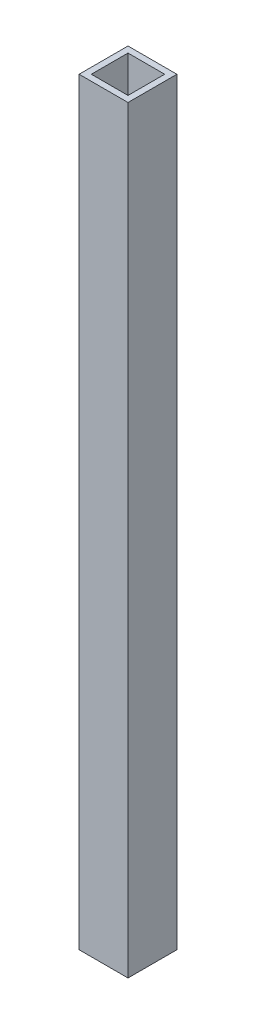
ISO-10303-21;
HEADER;
FILE_DESCRIPTION(('STEP AP214'),'2;1');
FILE_NAME('part.step','',(''),(''),'','','');
FILE_SCHEMA(('AUTOMOTIVE_DESIGN { 1 0 10303 214 1 1 1 1 }'));
ENDSEC;
DATA;
#1=APPLICATION_CONTEXT('core data for automotive mechanical design processes');
#2=APPLICATION_PROTOCOL_DEFINITION('international standard','automotive_design',2000,#1);
#3=PRODUCT_CONTEXT('',#1,'mechanical');
#4=PRODUCT('Part','Part','',(#3));
#5=PRODUCT_RELATED_PRODUCT_CATEGORY('part','',(#4));
#6=PRODUCT_DEFINITION_FORMATION('','',#4);
#7=PRODUCT_DEFINITION_CONTEXT('part definition',#1,'design');
#8=PRODUCT_DEFINITION('design','',#6,#7);
#9=PRODUCT_DEFINITION_SHAPE('','',#8);
#10=(LENGTH_UNIT() NAMED_UNIT(*) SI_UNIT(.MILLI.,.METRE.));
#11=(NAMED_UNIT(*) PLANE_ANGLE_UNIT() SI_UNIT($,.RADIAN.));
#12=(NAMED_UNIT(*) SI_UNIT($,.STERADIAN.) SOLID_ANGLE_UNIT());
#13=UNCERTAINTY_MEASURE_WITH_UNIT(LENGTH_MEASURE(1.E-05),#10,'distance_accuracy_value','');
#14=(GEOMETRIC_REPRESENTATION_CONTEXT(3) GLOBAL_UNCERTAINTY_ASSIGNED_CONTEXT((#13)) GLOBAL_UNIT_ASSIGNED_CONTEXT((#10,
#11,#12)) REPRESENTATION_CONTEXT('',''));
#15=CARTESIAN_POINT('',(0.,0.,0.));
#16=DIRECTION('',(0.,0.,1.));
#17=DIRECTION('',(1.,0.,0.));
#18=AXIS2_PLACEMENT_3D('',#15,#16,#17);
#19=CARTESIAN_POINT('',(0.,196.85,0.));
#20=DIRECTION('',(0.,-1.,0.));
#21=DIRECTION('',(0.,0.,-1.));
#22=AXIS2_PLACEMENT_3D('',#19,#20,#21);
#23=PLANE('',#22);
#24=DIRECTION('',(0.,0.,1.));
#25=VECTOR('',#24,1.);
#26=CARTESIAN_POINT('',(-6.35,196.85,-6.35));
#27=LINE('',#26,#25);
#28=CARTESIAN_POINT('',(-6.35,196.85,-6.35));
#29=VERTEX_POINT('',#28);
#30=CARTESIAN_POINT('',(-6.35,196.85,6.35));
#31=VERTEX_POINT('',#30);
#32=EDGE_CURVE('E142',#29,#31,#27,.T.);
#33=ORIENTED_EDGE('',*,*,#32,.T.);
#34=DIRECTION('',(1.,0.,0.));
#35=VECTOR('',#34,1.);
#36=CARTESIAN_POINT('',(6.35,196.85,6.35));
#37=LINE('',#36,#35);
#38=CARTESIAN_POINT('',(6.35,196.85,6.35));
#39=VERTEX_POINT('',#38);
#40=EDGE_CURVE('E145',#31,#39,#37,.T.);
#41=ORIENTED_EDGE('',*,*,#40,.T.);
#42=DIRECTION('',(0.,0.,-1.));
#43=VECTOR('',#42,1.);
#44=CARTESIAN_POINT('',(6.35,196.85,-6.35));
#45=LINE('',#44,#43);
#46=CARTESIAN_POINT('',(6.35,196.85,-6.35));
#47=VERTEX_POINT('',#46);
#48=EDGE_CURVE('E148',#39,#47,#45,.T.);
#49=ORIENTED_EDGE('',*,*,#48,.T.);
#50=DIRECTION('',(-1.,0.,0.));
#51=VECTOR('',#50,1.);
#52=CARTESIAN_POINT('',(6.35,196.85,-6.35));
#53=LINE('',#52,#51);
#54=EDGE_CURVE('E150',#47,#29,#53,.T.);
#55=ORIENTED_EDGE('',*,*,#54,.T.);
#56=EDGE_LOOP('',(#33,#41,#49,#55));
#57=FACE_BOUND('',#56,.T.);
#58=DIRECTION('',(0.,0.,1.));
#59=VECTOR('',#58,1.);
#60=CARTESIAN_POINT('',(-4.7625,196.85,4.7625));
#61=LINE('',#60,#59);
#62=CARTESIAN_POINT('',(-4.7625,196.85,-4.7625));
#63=VERTEX_POINT('',#62);
#64=CARTESIAN_POINT('',(-4.7625,196.85,4.7625));
#65=VERTEX_POINT('',#64);
#66=EDGE_CURVE('E106',#63,#65,#61,.T.);
#67=ORIENTED_EDGE('',*,*,#66,.F.);
#68=DIRECTION('',(-1.,0.,0.));
#69=VECTOR('',#68,1.);
#70=CARTESIAN_POINT('',(4.7625,196.85,-4.7625));
#71=LINE('',#70,#69);
#72=CARTESIAN_POINT('',(4.7625,196.85,-4.7625));
#73=VERTEX_POINT('',#72);
#74=EDGE_CURVE('E128',#73,#63,#71,.T.);
#75=ORIENTED_EDGE('',*,*,#74,.F.);
#76=DIRECTION('',(0.,0.,-1.));
#77=VECTOR('',#76,1.);
#78=CARTESIAN_POINT('',(4.7625,196.85,4.7625));
#79=LINE('',#78,#77);
#80=CARTESIAN_POINT('',(4.7625,196.85,4.7625));
#81=VERTEX_POINT('',#80);
#82=EDGE_CURVE('E126',#81,#73,#79,.T.);
#83=ORIENTED_EDGE('',*,*,#82,.F.);
#84=DIRECTION('',(1.,0.,0.));
#85=VECTOR('',#84,1.);
#86=CARTESIAN_POINT('',(4.7625,196.85,4.7625));
#87=LINE('',#86,#85);
#88=EDGE_CURVE('E114',#65,#81,#87,.T.);
#89=ORIENTED_EDGE('',*,*,#88,.F.);
#90=EDGE_LOOP('',(#67,#75,#83,#89));
#91=FACE_BOUND('',#90,.T.);
#92=ADVANCED_FACE('F41',(#57,#91),#23,.F.);
#93=CARTESIAN_POINT('',(0.,0.,0.));
#94=DIRECTION('',(0.,-1.,0.));
#95=DIRECTION('',(0.,0.,-1.));
#96=AXIS2_PLACEMENT_3D('',#93,#94,#95);
#97=PLANE('',#96);
#98=DIRECTION('',(0.,0.,1.));
#99=VECTOR('',#98,1.);
#100=CARTESIAN_POINT('',(-6.35,0.,-6.35));
#101=LINE('',#100,#99);
#102=CARTESIAN_POINT('',(-6.35,0.,-6.35));
#103=VERTEX_POINT('',#102);
#104=CARTESIAN_POINT('',(-6.35,0.,6.35));
#105=VERTEX_POINT('',#104);
#106=EDGE_CURVE('E122',#103,#105,#101,.T.);
#107=ORIENTED_EDGE('',*,*,#106,.F.);
#108=DIRECTION('',(-1.,0.,0.));
#109=VECTOR('',#108,1.);
#110=CARTESIAN_POINT('',(6.35,0.,-6.35));
#111=LINE('',#110,#109);
#112=CARTESIAN_POINT('',(6.35,0.,-6.35));
#113=VERTEX_POINT('',#112);
#114=EDGE_CURVE('E146',#113,#103,#111,.T.);
#115=ORIENTED_EDGE('',*,*,#114,.F.);
#116=DIRECTION('',(0.,0.,-1.));
#117=VECTOR('',#116,1.);
#118=CARTESIAN_POINT('',(6.35,0.,-6.35));
#119=LINE('',#118,#117);
#120=CARTESIAN_POINT('',(6.35,0.,6.35));
#121=VERTEX_POINT('',#120);
#122=EDGE_CURVE('E157',#121,#113,#119,.T.);
#123=ORIENTED_EDGE('',*,*,#122,.F.);
#124=DIRECTION('',(1.,0.,0.));
#125=VECTOR('',#124,1.);
#126=CARTESIAN_POINT('',(6.35,0.,6.35));
#127=LINE('',#126,#125);
#128=EDGE_CURVE('E155',#105,#121,#127,.T.);
#129=ORIENTED_EDGE('',*,*,#128,.F.);
#130=EDGE_LOOP('',(#107,#115,#123,#129));
#131=FACE_BOUND('',#130,.T.);
#132=DIRECTION('',(-1.,0.,0.));
#133=VECTOR('',#132,1.);
#134=CARTESIAN_POINT('',(4.7625,0.,-4.7625));
#135=LINE('',#134,#133);
#136=CARTESIAN_POINT('',(4.7625,0.,-4.7625));
#137=VERTEX_POINT('',#136);
#138=CARTESIAN_POINT('',(-4.7625,0.,-4.7625));
#139=VERTEX_POINT('',#138);
#140=EDGE_CURVE('E115',#137,#139,#135,.T.);
#141=ORIENTED_EDGE('',*,*,#140,.T.);
#142=DIRECTION('',(0.,0.,1.));
#143=VECTOR('',#142,1.);
#144=CARTESIAN_POINT('',(-4.7625,0.,4.7625));
#145=LINE('',#144,#143);
#146=CARTESIAN_POINT('',(-4.7625,0.,4.7625));
#147=VERTEX_POINT('',#146);
#148=EDGE_CURVE('E64',#139,#147,#145,.T.);
#149=ORIENTED_EDGE('',*,*,#148,.T.);
#150=DIRECTION('',(1.,0.,0.));
#151=VECTOR('',#150,1.);
#152=CARTESIAN_POINT('',(4.7625,0.,4.7625));
#153=LINE('',#152,#151);
#154=CARTESIAN_POINT('',(4.7625,0.,4.7625));
#155=VERTEX_POINT('',#154);
#156=EDGE_CURVE('E121',#147,#155,#153,.T.);
#157=ORIENTED_EDGE('',*,*,#156,.T.);
#158=DIRECTION('',(0.,0.,-1.));
#159=VECTOR('',#158,1.);
#160=CARTESIAN_POINT('',(4.7625,0.,4.7625));
#161=LINE('',#160,#159);
#162=EDGE_CURVE('E134',#155,#137,#161,.T.);
#163=ORIENTED_EDGE('',*,*,#162,.T.);
#164=EDGE_LOOP('',(#141,#149,#157,#163));
#165=FACE_BOUND('',#164,.T.);
#166=ADVANCED_FACE('F175',(#131,#165),#97,.T.);
#167=CARTESIAN_POINT('',(-6.35,196.85,-6.35));
#168=DIRECTION('',(1.,0.,0.));
#169=DIRECTION('',(0.,0.,-1.));
#170=AXIS2_PLACEMENT_3D('',#167,#168,#169);
#171=PLANE('',#170);
#172=ORIENTED_EDGE('',*,*,#106,.T.);
#173=DIRECTION('',(0.,-1.,0.));
#174=VECTOR('',#173,1.);
#175=CARTESIAN_POINT('',(-6.35,196.85,6.35));
#176=LINE('',#175,#174);
#177=EDGE_CURVE('E11',#31,#105,#176,.T.);
#178=ORIENTED_EDGE('',*,*,#177,.F.);
#179=ORIENTED_EDGE('',*,*,#32,.F.);
#180=DIRECTION('',(0.,-1.,0.));
#181=VECTOR('',#180,1.);
#182=CARTESIAN_POINT('',(-6.35,196.85,-6.35));
#183=LINE('',#182,#181);
#184=EDGE_CURVE('E152',#29,#103,#183,.T.);
#185=ORIENTED_EDGE('',*,*,#184,.T.);
#186=EDGE_LOOP('',(#172,#178,#179,#185));
#187=FACE_BOUND('',#186,.T.);
#188=ADVANCED_FACE('F43',(#187),#171,.F.);
#189=CARTESIAN_POINT('',(6.35,196.85,6.35));
#190=DIRECTION('',(0.,0.,-1.));
#191=DIRECTION('',(-1.,0.,0.));
#192=AXIS2_PLACEMENT_3D('',#189,#190,#191);
#193=PLANE('',#192);
#194=ORIENTED_EDGE('',*,*,#128,.T.);
#195=DIRECTION('',(0.,-1.,0.));
#196=VECTOR('',#195,1.);
#197=CARTESIAN_POINT('',(6.35,196.85,6.35));
#198=LINE('',#197,#196);
#199=EDGE_CURVE('E49',#39,#121,#198,.T.);
#200=ORIENTED_EDGE('',*,*,#199,.F.);
#201=ORIENTED_EDGE('',*,*,#40,.F.);
#202=ORIENTED_EDGE('',*,*,#177,.T.);
#203=EDGE_LOOP('',(#194,#200,#201,#202));
#204=FACE_BOUND('',#203,.T.);
#205=ADVANCED_FACE('F185',(#204),#193,.F.);
#206=CARTESIAN_POINT('',(6.35,196.85,-6.35));
#207=DIRECTION('',(-1.,0.,0.));
#208=DIRECTION('',(0.,0.,1.));
#209=AXIS2_PLACEMENT_3D('',#206,#207,#208);
#210=PLANE('',#209);
#211=ORIENTED_EDGE('',*,*,#122,.T.);
#212=DIRECTION('',(0.,-1.,0.));
#213=VECTOR('',#212,1.);
#214=CARTESIAN_POINT('',(6.35,196.85,-6.35));
#215=LINE('',#214,#213);
#216=EDGE_CURVE('E162',#47,#113,#215,.T.);
#217=ORIENTED_EDGE('',*,*,#216,.F.);
#218=ORIENTED_EDGE('',*,*,#48,.F.);
#219=ORIENTED_EDGE('',*,*,#199,.T.);
#220=EDGE_LOOP('',(#211,#217,#218,#219));
#221=FACE_BOUND('',#220,.T.);
#222=ADVANCED_FACE('F169',(#221),#210,.F.);
#223=CARTESIAN_POINT('',(6.35,196.85,-6.35));
#224=DIRECTION('',(0.,0.,1.));
#225=DIRECTION('',(1.,0.,0.));
#226=AXIS2_PLACEMENT_3D('',#223,#224,#225);
#227=PLANE('',#226);
#228=ORIENTED_EDGE('',*,*,#114,.T.);
#229=ORIENTED_EDGE('',*,*,#184,.F.);
#230=ORIENTED_EDGE('',*,*,#54,.F.);
#231=ORIENTED_EDGE('',*,*,#216,.T.);
#232=EDGE_LOOP('',(#228,#229,#230,#231));
#233=FACE_BOUND('',#232,.T.);
#234=ADVANCED_FACE('F179',(#233),#227,.F.);
#235=CARTESIAN_POINT('',(-4.7625,196.85,4.7625));
#236=DIRECTION('',(1.,0.,0.));
#237=DIRECTION('',(0.,0.,-1.));
#238=AXIS2_PLACEMENT_3D('',#235,#236,#237);
#239=PLANE('',#238);
#240=ORIENTED_EDGE('',*,*,#148,.F.);
#241=DIRECTION('',(0.,-1.,0.));
#242=VECTOR('',#241,1.);
#243=CARTESIAN_POINT('',(-4.7625,196.85,-4.7625));
#244=LINE('',#243,#242);
#245=EDGE_CURVE('E110',#63,#139,#244,.T.);
#246=ORIENTED_EDGE('',*,*,#245,.F.);
#247=ORIENTED_EDGE('',*,*,#66,.T.);
#248=DIRECTION('',(0.,-1.,0.));
#249=VECTOR('',#248,1.);
#250=CARTESIAN_POINT('',(-4.7625,196.85,4.7625));
#251=LINE('',#250,#249);
#252=EDGE_CURVE('E109',#65,#147,#251,.T.);
#253=ORIENTED_EDGE('',*,*,#252,.T.);
#254=EDGE_LOOP('',(#240,#246,#247,#253));
#255=FACE_BOUND('',#254,.T.);
#256=ADVANCED_FACE('F108',(#255),#239,.T.);
#257=CARTESIAN_POINT('',(4.7625,196.85,4.7625));
#258=DIRECTION('',(0.,0.,-1.));
#259=DIRECTION('',(-1.,0.,0.));
#260=AXIS2_PLACEMENT_3D('',#257,#258,#259);
#261=PLANE('',#260);
#262=ORIENTED_EDGE('',*,*,#156,.F.);
#263=ORIENTED_EDGE('',*,*,#252,.F.);
#264=ORIENTED_EDGE('',*,*,#88,.T.);
#265=DIRECTION('',(0.,-1.,0.));
#266=VECTOR('',#265,1.);
#267=CARTESIAN_POINT('',(4.7625,196.85,4.7625));
#268=LINE('',#267,#266);
#269=EDGE_CURVE('E123',#81,#155,#268,.T.);
#270=ORIENTED_EDGE('',*,*,#269,.T.);
#271=EDGE_LOOP('',(#262,#263,#264,#270));
#272=FACE_BOUND('',#271,.T.);
#273=ADVANCED_FACE('F118',(#272),#261,.T.);
#274=CARTESIAN_POINT('',(4.7625,196.85,4.7625));
#275=DIRECTION('',(-1.,0.,0.));
#276=DIRECTION('',(0.,0.,1.));
#277=AXIS2_PLACEMENT_3D('',#274,#275,#276);
#278=PLANE('',#277);
#279=ORIENTED_EDGE('',*,*,#162,.F.);
#280=ORIENTED_EDGE('',*,*,#269,.F.);
#281=ORIENTED_EDGE('',*,*,#82,.T.);
#282=DIRECTION('',(0.,-1.,0.));
#283=VECTOR('',#282,1.);
#284=CARTESIAN_POINT('',(4.7625,196.85,-4.7625));
#285=LINE('',#284,#283);
#286=EDGE_CURVE('E56',#73,#137,#285,.T.);
#287=ORIENTED_EDGE('',*,*,#286,.T.);
#288=EDGE_LOOP('',(#279,#280,#281,#287));
#289=FACE_BOUND('',#288,.T.);
#290=ADVANCED_FACE('F208',(#289),#278,.T.);
#291=CARTESIAN_POINT('',(4.7625,196.85,-4.7625));
#292=DIRECTION('',(0.,0.,1.));
#293=DIRECTION('',(1.,0.,0.));
#294=AXIS2_PLACEMENT_3D('',#291,#292,#293);
#295=PLANE('',#294);
#296=ORIENTED_EDGE('',*,*,#140,.F.);
#297=ORIENTED_EDGE('',*,*,#286,.F.);
#298=ORIENTED_EDGE('',*,*,#74,.T.);
#299=ORIENTED_EDGE('',*,*,#245,.T.);
#300=EDGE_LOOP('',(#296,#297,#298,#299));
#301=FACE_BOUND('',#300,.T.);
#302=ADVANCED_FACE('F212',(#301),#295,.T.);
#303=CLOSED_SHELL('',(#92,#166,#188,#205,#222,#234,#256,#273,#290,#302));
#304=MANIFOLD_SOLID_BREP('B2',#303);
#305=ADVANCED_BREP_SHAPE_REPRESENTATION('',(#18,#304),#14);
#306=SHAPE_DEFINITION_REPRESENTATION(#9,#305);
ENDSEC;
END-ISO-10303-21;
